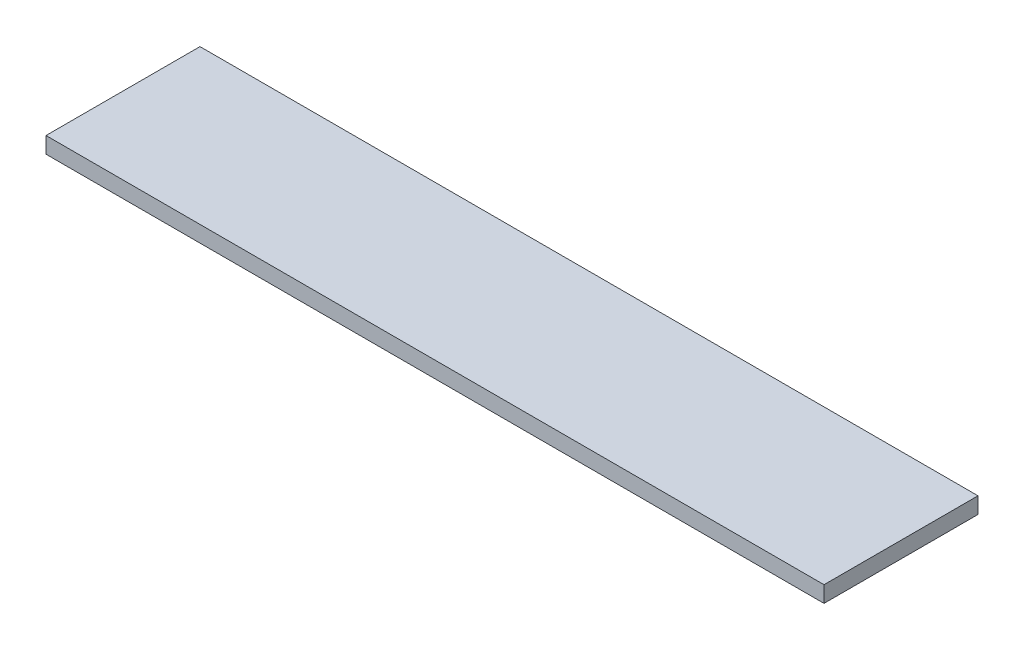
ISO-10303-21;
HEADER;
FILE_DESCRIPTION(('STEP AP214'),'2;1');
FILE_NAME('part.step','',(''),(''),'','','');
FILE_SCHEMA(('AUTOMOTIVE_DESIGN { 1 0 10303 214 1 1 1 1 }'));
ENDSEC;
DATA;
#1=APPLICATION_CONTEXT('core data for automotive mechanical design processes');
#2=APPLICATION_PROTOCOL_DEFINITION('international standard','automotive_design',2000,#1);
#3=PRODUCT_CONTEXT('',#1,'mechanical');
#4=PRODUCT('Part','Part','',(#3));
#5=PRODUCT_RELATED_PRODUCT_CATEGORY('part','',(#4));
#6=PRODUCT_DEFINITION_FORMATION('','',#4);
#7=PRODUCT_DEFINITION_CONTEXT('part definition',#1,'design');
#8=PRODUCT_DEFINITION('design','',#6,#7);
#9=PRODUCT_DEFINITION_SHAPE('','',#8);
#10=(LENGTH_UNIT() NAMED_UNIT(*) SI_UNIT(.MILLI.,.METRE.));
#11=(NAMED_UNIT(*) PLANE_ANGLE_UNIT() SI_UNIT($,.RADIAN.));
#12=(NAMED_UNIT(*) SI_UNIT($,.STERADIAN.) SOLID_ANGLE_UNIT());
#13=UNCERTAINTY_MEASURE_WITH_UNIT(LENGTH_MEASURE(1.E-05),#10,'distance_accuracy_value','');
#14=(GEOMETRIC_REPRESENTATION_CONTEXT(3) GLOBAL_UNCERTAINTY_ASSIGNED_CONTEXT((#13)) GLOBAL_UNIT_ASSIGNED_CONTEXT((#10,
#11,#12)) REPRESENTATION_CONTEXT('',''));
#15=CARTESIAN_POINT('',(0.,0.,0.));
#16=DIRECTION('',(0.,0.,1.));
#17=DIRECTION('',(1.,0.,0.));
#18=AXIS2_PLACEMENT_3D('',#15,#16,#17);
#19=CARTESIAN_POINT('',(-304.8,12.7,120.65));
#20=DIRECTION('',(1.,0.,0.));
#21=DIRECTION('',(0.,0.,-1.));
#22=AXIS2_PLACEMENT_3D('',#19,#20,#21);
#23=PLANE('',#22);
#24=DIRECTION('',(0.,0.,1.));
#25=VECTOR('',#24,1.);
#26=CARTESIAN_POINT('',(-304.8,0.,120.65));
#27=LINE('',#26,#25);
#28=CARTESIAN_POINT('',(-304.8,0.,0.));
#29=VERTEX_POINT('',#28);
#30=CARTESIAN_POINT('',(-304.8,0.,120.65));
#31=VERTEX_POINT('',#30);
#32=EDGE_CURVE('E96',#29,#31,#27,.T.);
#33=ORIENTED_EDGE('',*,*,#32,.T.);
#34=DIRECTION('',(0.,-1.,0.));
#35=VECTOR('',#34,1.);
#36=CARTESIAN_POINT('',(-304.8,12.7,120.65));
#37=LINE('',#36,#35);
#38=CARTESIAN_POINT('',(-304.8,12.7,120.65));
#39=VERTEX_POINT('',#38);
#40=EDGE_CURVE('E11',#39,#31,#37,.T.);
#41=ORIENTED_EDGE('',*,*,#40,.F.);
#42=DIRECTION('',(0.,0.,1.));
#43=VECTOR('',#42,1.);
#44=CARTESIAN_POINT('',(-304.8,12.7,120.65));
#45=LINE('',#44,#43);
#46=CARTESIAN_POINT('',(-304.8,12.7,0.));
#47=VERTEX_POINT('',#46);
#48=EDGE_CURVE('E84',#47,#39,#45,.T.);
#49=ORIENTED_EDGE('',*,*,#48,.F.);
#50=DIRECTION('',(0.,-1.,0.));
#51=VECTOR('',#50,1.);
#52=CARTESIAN_POINT('',(-304.8,12.7,0.));
#53=LINE('',#52,#51);
#54=EDGE_CURVE('E92',#47,#29,#53,.T.);
#55=ORIENTED_EDGE('',*,*,#54,.T.);
#56=EDGE_LOOP('',(#33,#41,#49,#55));
#57=FACE_BOUND('',#56,.T.);
#58=ADVANCED_FACE('F33',(#57),#23,.F.);
#59=CARTESIAN_POINT('',(304.8,12.7,120.65));
#60=DIRECTION('',(0.,0.,-1.));
#61=DIRECTION('',(-1.,0.,0.));
#62=AXIS2_PLACEMENT_3D('',#59,#60,#61);
#63=PLANE('',#62);
#64=DIRECTION('',(1.,0.,0.));
#65=VECTOR('',#64,1.);
#66=CARTESIAN_POINT('',(304.8,0.,120.65));
#67=LINE('',#66,#65);
#68=CARTESIAN_POINT('',(304.8,0.,120.65));
#69=VERTEX_POINT('',#68);
#70=EDGE_CURVE('E88',#31,#69,#67,.T.);
#71=ORIENTED_EDGE('',*,*,#70,.T.);
#72=DIRECTION('',(0.,-1.,0.));
#73=VECTOR('',#72,1.);
#74=CARTESIAN_POINT('',(304.8,12.7,120.65));
#75=LINE('',#74,#73);
#76=CARTESIAN_POINT('',(304.8,12.7,120.65));
#77=VERTEX_POINT('',#76);
#78=EDGE_CURVE('E41',#77,#69,#75,.T.);
#79=ORIENTED_EDGE('',*,*,#78,.F.);
#80=DIRECTION('',(1.,0.,0.));
#81=VECTOR('',#80,1.);
#82=CARTESIAN_POINT('',(304.8,12.7,120.65));
#83=LINE('',#82,#81);
#84=EDGE_CURVE('E79',#39,#77,#83,.T.);
#85=ORIENTED_EDGE('',*,*,#84,.F.);
#86=ORIENTED_EDGE('',*,*,#40,.T.);
#87=EDGE_LOOP('',(#71,#79,#85,#86));
#88=FACE_BOUND('',#87,.T.);
#89=ADVANCED_FACE('F87',(#88),#63,.F.);
#90=CARTESIAN_POINT('',(304.8,12.7,120.65));
#91=DIRECTION('',(-1.,0.,0.));
#92=DIRECTION('',(0.,0.,1.));
#93=AXIS2_PLACEMENT_3D('',#90,#91,#92);
#94=PLANE('',#93);
#95=DIRECTION('',(0.,0.,-1.));
#96=VECTOR('',#95,1.);
#97=CARTESIAN_POINT('',(304.8,0.,120.65));
#98=LINE('',#97,#96);
#99=CARTESIAN_POINT('',(304.8,0.,0.));
#100=VERTEX_POINT('',#99);
#101=EDGE_CURVE('E66',#69,#100,#98,.T.);
#102=ORIENTED_EDGE('',*,*,#101,.T.);
#103=DIRECTION('',(0.,-1.,0.));
#104=VECTOR('',#103,1.);
#105=CARTESIAN_POINT('',(304.8,12.7,0.));
#106=LINE('',#105,#104);
#107=CARTESIAN_POINT('',(304.8,12.7,0.));
#108=VERTEX_POINT('',#107);
#109=EDGE_CURVE('E89',#108,#100,#106,.T.);
#110=ORIENTED_EDGE('',*,*,#109,.F.);
#111=DIRECTION('',(0.,0.,-1.));
#112=VECTOR('',#111,1.);
#113=CARTESIAN_POINT('',(304.8,12.7,120.65));
#114=LINE('',#113,#112);
#115=EDGE_CURVE('E82',#77,#108,#114,.T.);
#116=ORIENTED_EDGE('',*,*,#115,.F.);
#117=ORIENTED_EDGE('',*,*,#78,.T.);
#118=EDGE_LOOP('',(#102,#110,#116,#117));
#119=FACE_BOUND('',#118,.T.);
#120=ADVANCED_FACE('F90',(#119),#94,.F.);
#121=CARTESIAN_POINT('',(304.8,12.7,0.));
#122=DIRECTION('',(0.,0.,1.));
#123=DIRECTION('',(1.,0.,0.));
#124=AXIS2_PLACEMENT_3D('',#121,#122,#123);
#125=PLANE('',#124);
#126=DIRECTION('',(-1.,0.,0.));
#127=VECTOR('',#126,1.);
#128=CARTESIAN_POINT('',(304.8,0.,0.));
#129=LINE('',#128,#127);
#130=EDGE_CURVE('E72',#100,#29,#129,.T.);
#131=ORIENTED_EDGE('',*,*,#130,.T.);
#132=ORIENTED_EDGE('',*,*,#54,.F.);
#133=DIRECTION('',(-1.,0.,0.));
#134=VECTOR('',#133,1.);
#135=CARTESIAN_POINT('',(304.8,12.7,0.));
#136=LINE('',#135,#134);
#137=EDGE_CURVE('E49',#108,#47,#136,.T.);
#138=ORIENTED_EDGE('',*,*,#137,.F.);
#139=ORIENTED_EDGE('',*,*,#109,.T.);
#140=EDGE_LOOP('',(#131,#132,#138,#139));
#141=FACE_BOUND('',#140,.T.);
#142=ADVANCED_FACE('F103',(#141),#125,.F.);
#143=CARTESIAN_POINT('',(0.,12.7,0.));
#144=DIRECTION('',(0.,1.,0.));
#145=DIRECTION('',(0.,0.,1.));
#146=AXIS2_PLACEMENT_3D('',#143,#144,#145);
#147=PLANE('',#146);
#148=ORIENTED_EDGE('',*,*,#48,.T.);
#149=ORIENTED_EDGE('',*,*,#84,.T.);
#150=ORIENTED_EDGE('',*,*,#115,.T.);
#151=ORIENTED_EDGE('',*,*,#137,.T.);
#152=EDGE_LOOP('',(#148,#149,#150,#151));
#153=FACE_BOUND('',#152,.T.);
#154=ADVANCED_FACE('F80',(#153),#147,.T.);
#155=CARTESIAN_POINT('',(0.,0.,0.));
#156=DIRECTION('',(0.,1.,0.));
#157=DIRECTION('',(0.,0.,1.));
#158=AXIS2_PLACEMENT_3D('',#155,#156,#157);
#159=PLANE('',#158);
#160=ORIENTED_EDGE('',*,*,#32,.F.);
#161=ORIENTED_EDGE('',*,*,#130,.F.);
#162=ORIENTED_EDGE('',*,*,#101,.F.);
#163=ORIENTED_EDGE('',*,*,#70,.F.);
#164=EDGE_LOOP('',(#160,#161,#162,#163));
#165=FACE_BOUND('',#164,.T.);
#166=ADVANCED_FACE('F106',(#165),#159,.F.);
#167=CLOSED_SHELL('',(#58,#89,#120,#142,#154,#166));
#168=MANIFOLD_SOLID_BREP('B2',#167);
#169=ADVANCED_BREP_SHAPE_REPRESENTATION('',(#18,#168),#14);
#170=SHAPE_DEFINITION_REPRESENTATION(#9,#169);
ENDSEC;
END-ISO-10303-21;
